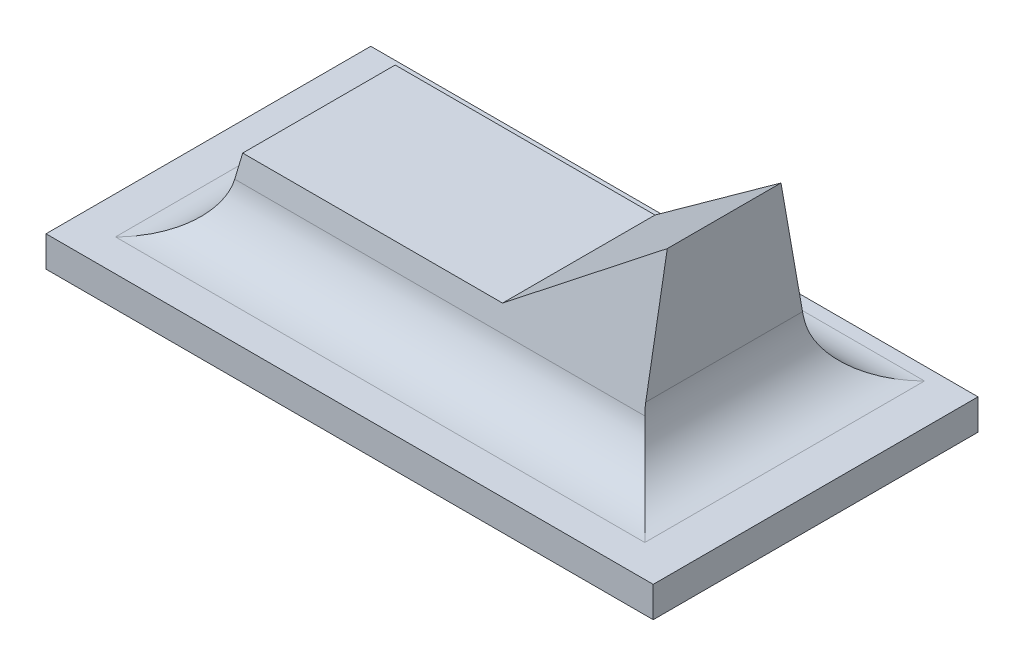
ISO-10303-21;
HEADER;
FILE_DESCRIPTION(('STEP AP214'),'2;1');
FILE_NAME('part.step','',(''),(''),'','','');
FILE_SCHEMA(('AUTOMOTIVE_DESIGN { 1 0 10303 214 1 1 1 1 }'));
ENDSEC;
DATA;
#1=APPLICATION_CONTEXT('core data for automotive mechanical design processes');
#2=APPLICATION_PROTOCOL_DEFINITION('international standard','automotive_design',2000,#1);
#3=PRODUCT_CONTEXT('',#1,'mechanical');
#4=PRODUCT('Part','Part','',(#3));
#5=PRODUCT_RELATED_PRODUCT_CATEGORY('part','',(#4));
#6=PRODUCT_DEFINITION_FORMATION('','',#4);
#7=PRODUCT_DEFINITION_CONTEXT('part definition',#1,'design');
#8=PRODUCT_DEFINITION('design','',#6,#7);
#9=PRODUCT_DEFINITION_SHAPE('','',#8);
#10=(LENGTH_UNIT() NAMED_UNIT(*) SI_UNIT(.MILLI.,.METRE.));
#11=(NAMED_UNIT(*) PLANE_ANGLE_UNIT() SI_UNIT($,.RADIAN.));
#12=(NAMED_UNIT(*) SI_UNIT($,.STERADIAN.) SOLID_ANGLE_UNIT());
#13=UNCERTAINTY_MEASURE_WITH_UNIT(LENGTH_MEASURE(1.E-05),#10,'distance_accuracy_value','');
#14=(GEOMETRIC_REPRESENTATION_CONTEXT(3) GLOBAL_UNCERTAINTY_ASSIGNED_CONTEXT((#13)) GLOBAL_UNIT_ASSIGNED_CONTEXT((#10,
#11,#12)) REPRESENTATION_CONTEXT('',''));
#15=CARTESIAN_POINT('',(0.,0.,0.));
#16=DIRECTION('',(0.,0.,1.));
#17=DIRECTION('',(1.,0.,0.));
#18=AXIS2_PLACEMENT_3D('',#15,#16,#17);
#19=CARTESIAN_POINT('',(0.,0.,-16.1));
#20=DIRECTION('',(-1.,0.,0.));
#21=DIRECTION('',(0.,0.,1.));
#22=AXIS2_PLACEMENT_3D('',#19,#20,#21);
#23=PLANE('',#22);
#24=DIRECTION('',(0.,-1.,0.));
#25=VECTOR('',#24,1.);
#26=CARTESIAN_POINT('',(0.,0.,0.));
#27=LINE('',#26,#25);
#28=CARTESIAN_POINT('',(0.,1.52,0.));
#29=VERTEX_POINT('',#28);
#30=CARTESIAN_POINT('',(0.,0.,0.));
#31=VERTEX_POINT('',#30);
#32=EDGE_CURVE('E181',#29,#31,#27,.T.);
#33=ORIENTED_EDGE('',*,*,#32,.F.);
#34=DIRECTION('',(0.,0.,1.));
#35=VECTOR('',#34,1.);
#36=CARTESIAN_POINT('',(0.,1.52,-16.1));
#37=LINE('',#36,#35);
#38=CARTESIAN_POINT('',(0.,1.52,-16.1));
#39=VERTEX_POINT('',#38);
#40=EDGE_CURVE('E216',#39,#29,#37,.T.);
#41=ORIENTED_EDGE('',*,*,#40,.F.);
#42=DIRECTION('',(0.,-1.,0.));
#43=VECTOR('',#42,1.);
#44=CARTESIAN_POINT('',(0.,0.,-16.1));
#45=LINE('',#44,#43);
#46=CARTESIAN_POINT('',(0.,0.,-16.1));
#47=VERTEX_POINT('',#46);
#48=EDGE_CURVE('E184',#39,#47,#45,.T.);
#49=ORIENTED_EDGE('',*,*,#48,.T.);
#50=DIRECTION('',(0.,0.,1.));
#51=VECTOR('',#50,1.);
#52=CARTESIAN_POINT('',(0.,0.,-16.1));
#53=LINE('',#52,#51);
#54=EDGE_CURVE('E201',#47,#31,#53,.T.);
#55=ORIENTED_EDGE('',*,*,#54,.T.);
#56=EDGE_LOOP('',(#33,#41,#49,#55));
#57=FACE_BOUND('',#56,.T.);
#58=ADVANCED_FACE('F43',(#57),#23,.T.);
#59=CARTESIAN_POINT('',(0.,1.52,-16.1));
#60=DIRECTION('',(0.,1.,0.));
#61=DIRECTION('',(0.,0.,1.));
#62=AXIS2_PLACEMENT_3D('',#59,#60,#61);
#63=PLANE('',#62);
#64=DIRECTION('',(0.,0.,1.));
#65=VECTOR('',#64,1.);
#66=CARTESIAN_POINT('',(1.85792397591769,1.52,-12.9347771305505));
#67=LINE('',#66,#65);
#68=CARTESIAN_POINT('',(1.85792397591769,1.52,-1.58792397591769));
#69=VERTEX_POINT('',#68);
#70=CARTESIAN_POINT('',(1.85792397591769,1.52,-15.4520760240823));
#71=VERTEX_POINT('',#70);
#72=EDGE_CURVE('E235',#69,#71,#67,.F.);
#73=ORIENTED_EDGE('',*,*,#72,.T.);
#74=DIRECTION('',(-1.,0.,0.));
#75=VECTOR('',#74,1.);
#76=CARTESIAN_POINT('',(25.094859471218,1.52,-15.4520760240823));
#77=LINE('',#76,#75);
#78=CARTESIAN_POINT('',(28.094859471218,1.52,-15.4520760240823));
#79=VERTEX_POINT('',#78);
#80=EDGE_CURVE('E238',#71,#79,#77,.F.);
#81=ORIENTED_EDGE('',*,*,#80,.T.);
#82=DIRECTION('',(0.,0.,1.));
#83=VECTOR('',#82,1.);
#84=CARTESIAN_POINT('',(28.094859471218,1.52,-4.10522286944953));
#85=LINE('',#84,#83);
#86=CARTESIAN_POINT('',(28.094859471218,1.52,-1.58792397591769));
#87=VERTEX_POINT('',#86);
#88=EDGE_CURVE('E229',#79,#87,#85,.T.);
#89=ORIENTED_EDGE('',*,*,#88,.T.);
#90=DIRECTION('',(1.,0.,0.));
#91=VECTOR('',#90,1.);
#92=CARTESIAN_POINT('',(4.37522286944952,1.52,-1.58792397591769));
#93=LINE('',#92,#91);
#94=EDGE_CURVE('E232',#87,#69,#93,.F.);
#95=ORIENTED_EDGE('',*,*,#94,.T.);
#96=EDGE_LOOP('',(#73,#81,#89,#95));
#97=FACE_BOUND('',#96,.T.);
#98=DIRECTION('',(-1.,0.,0.));
#99=VECTOR('',#98,1.);
#100=CARTESIAN_POINT('',(0.,1.52,0.));
#101=LINE('',#100,#99);
#102=CARTESIAN_POINT('',(30.1,1.52,0.));
#103=VERTEX_POINT('',#102);
#104=EDGE_CURVE('E189',#103,#29,#101,.T.);
#105=ORIENTED_EDGE('',*,*,#104,.F.);
#106=DIRECTION('',(0.,0.,1.));
#107=VECTOR('',#106,1.);
#108=CARTESIAN_POINT('',(30.1,1.52,-16.1));
#109=LINE('',#108,#107);
#110=CARTESIAN_POINT('',(30.1,1.52,-16.1));
#111=VERTEX_POINT('',#110);
#112=EDGE_CURVE('E219',#111,#103,#109,.T.);
#113=ORIENTED_EDGE('',*,*,#112,.F.);
#114=DIRECTION('',(-1.,0.,0.));
#115=VECTOR('',#114,1.);
#116=CARTESIAN_POINT('',(0.,1.52,-16.1));
#117=LINE('',#116,#115);
#118=EDGE_CURVE('E197',#111,#39,#117,.T.);
#119=ORIENTED_EDGE('',*,*,#118,.T.);
#120=ORIENTED_EDGE('',*,*,#40,.T.);
#121=EDGE_LOOP('',(#105,#113,#119,#120));
#122=FACE_BOUND('',#121,.T.);
#123=ADVANCED_FACE('F294',(#97,#122),#63,.T.);
#124=CARTESIAN_POINT('',(30.1,0.,-16.1));
#125=DIRECTION('',(1.,0.,0.));
#126=DIRECTION('',(0.,0.,-1.));
#127=AXIS2_PLACEMENT_3D('',#124,#125,#126);
#128=PLANE('',#127);
#129=DIRECTION('',(0.,1.,0.));
#130=VECTOR('',#129,1.);
#131=CARTESIAN_POINT('',(30.1,0.,0.));
#132=LINE('',#131,#130);
#133=CARTESIAN_POINT('',(30.1,0.,0.));
#134=VERTEX_POINT('',#133);
#135=EDGE_CURVE('E209',#134,#103,#132,.T.);
#136=ORIENTED_EDGE('',*,*,#135,.F.);
#137=DIRECTION('',(0.,0.,1.));
#138=VECTOR('',#137,1.);
#139=CARTESIAN_POINT('',(30.1,0.,-16.1));
#140=LINE('',#139,#138);
#141=CARTESIAN_POINT('',(30.1,0.,-16.1));
#142=VERTEX_POINT('',#141);
#143=EDGE_CURVE('E222',#142,#134,#140,.T.);
#144=ORIENTED_EDGE('',*,*,#143,.F.);
#145=DIRECTION('',(0.,1.,0.));
#146=VECTOR('',#145,1.);
#147=CARTESIAN_POINT('',(30.1,0.,-16.1));
#148=LINE('',#147,#146);
#149=EDGE_CURVE('E193',#142,#111,#148,.T.);
#150=ORIENTED_EDGE('',*,*,#149,.T.);
#151=ORIENTED_EDGE('',*,*,#112,.T.);
#152=EDGE_LOOP('',(#136,#144,#150,#151));
#153=FACE_BOUND('',#152,.T.);
#154=ADVANCED_FACE('F297',(#153),#128,.T.);
#155=CARTESIAN_POINT('',(0.,0.,-16.1));
#156=DIRECTION('',(0.,-1.,0.));
#157=DIRECTION('',(0.,0.,-1.));
#158=AXIS2_PLACEMENT_3D('',#155,#156,#157);
#159=PLANE('',#158);
#160=DIRECTION('',(1.,0.,0.));
#161=VECTOR('',#160,1.);
#162=CARTESIAN_POINT('',(0.,0.,0.));
#163=LINE('',#162,#161);
#164=EDGE_CURVE('E205',#31,#134,#163,.T.);
#165=ORIENTED_EDGE('',*,*,#164,.F.);
#166=ORIENTED_EDGE('',*,*,#54,.F.);
#167=DIRECTION('',(1.,0.,0.));
#168=VECTOR('',#167,1.);
#169=CARTESIAN_POINT('',(0.,0.,-16.1));
#170=LINE('',#169,#168);
#171=EDGE_CURVE('E188',#47,#142,#170,.T.);
#172=ORIENTED_EDGE('',*,*,#171,.T.);
#173=ORIENTED_EDGE('',*,*,#143,.T.);
#174=EDGE_LOOP('',(#165,#166,#172,#173));
#175=FACE_BOUND('',#174,.T.);
#176=ADVANCED_FACE('F314',(#175),#159,.T.);
#177=CARTESIAN_POINT('',(0.,0.,-16.1));
#178=DIRECTION('',(0.,0.,-1.));
#179=DIRECTION('',(-1.,0.,0.));
#180=AXIS2_PLACEMENT_3D('',#177,#178,#179);
#181=PLANE('',#180);
#182=ORIENTED_EDGE('',*,*,#48,.F.);
#183=ORIENTED_EDGE('',*,*,#118,.F.);
#184=ORIENTED_EDGE('',*,*,#149,.F.);
#185=ORIENTED_EDGE('',*,*,#171,.F.);
#186=EDGE_LOOP('',(#182,#183,#184,#185));
#187=FACE_BOUND('',#186,.T.);
#188=ADVANCED_FACE('F311',(#187),#181,.T.);
#189=CARTESIAN_POINT('',(0.,0.,0.));
#190=DIRECTION('',(0.,0.,-1.));
#191=DIRECTION('',(-1.,0.,0.));
#192=AXIS2_PLACEMENT_3D('',#189,#190,#191);
#193=PLANE('',#192);
#194=ORIENTED_EDGE('',*,*,#32,.T.);
#195=ORIENTED_EDGE('',*,*,#164,.T.);
#196=ORIENTED_EDGE('',*,*,#135,.T.);
#197=ORIENTED_EDGE('',*,*,#104,.T.);
#198=EDGE_LOOP('',(#194,#195,#196,#197));
#199=FACE_BOUND('',#198,.T.);
#200=ADVANCED_FACE('F302',(#199),#193,.F.);
#201=CARTESIAN_POINT('',(5.01,5.12,-12.3));
#202=DIRECTION('',(-0.984807753012208,0.173648177666931,0.));
#203=DIRECTION('',(-0.173648177666931,-0.984807753012208,0.));
#204=AXIS2_PLACEMENT_3D('',#201,#202,#203);
#205=PLANE('',#204);
#206=DIRECTION('',(0.171087869746036,0.970287525247814,0.171087869746036));
#207=VECTOR('',#206,1.);
#208=CARTESIAN_POINT('',(5.01,5.12,-12.3));
#209=LINE('',#208,#207);
#210=CARTESIAN_POINT('',(4.81234723495431,3.99905546699921,-12.4976527650457));
#211=VERTEX_POINT('',#210);
#212=CARTESIAN_POINT('',(5.01,5.12,-12.3));
#213=VERTEX_POINT('',#212);
#214=EDGE_CURVE('E178',#211,#213,#209,.T.);
#215=ORIENTED_EDGE('',*,*,#214,.F.);
#216=DIRECTION('',(0.,0.,1.));
#217=VECTOR('',#216,1.);
#218=CARTESIAN_POINT('',(4.81234723495431,3.99905546699921,-4.10522286944953));
#219=LINE('',#218,#217);
#220=CARTESIAN_POINT('',(4.81234723495431,3.99905546699921,-4.54234723495431));
#221=VERTEX_POINT('',#220);
#222=EDGE_CURVE('E242',#211,#221,#219,.T.);
#223=ORIENTED_EDGE('',*,*,#222,.T.);
#224=DIRECTION('',(0.171087869746036,0.970287525247814,-0.171087869746036));
#225=VECTOR('',#224,1.);
#226=CARTESIAN_POINT('',(5.23128920735723,6.37499345856266,-4.96128920735723));
#227=LINE('',#226,#225);
#228=CARTESIAN_POINT('',(5.01,5.12,-4.74));
#229=VERTEX_POINT('',#228);
#230=EDGE_CURVE('E177',#221,#229,#227,.T.);
#231=ORIENTED_EDGE('',*,*,#230,.T.);
#232=DIRECTION('',(0.,0.,1.));
#233=VECTOR('',#232,1.);
#234=CARTESIAN_POINT('',(5.01,5.12,-12.3));
#235=LINE('',#234,#233);
#236=EDGE_CURVE('E157',#213,#229,#235,.T.);
#237=ORIENTED_EDGE('',*,*,#236,.F.);
#238=EDGE_LOOP('',(#215,#223,#231,#237));
#239=FACE_BOUND('',#238,.T.);
#240=ADVANCED_FACE('F284',(#239),#205,.T.);
#241=CARTESIAN_POINT('',(5.01,5.12,-12.3));
#242=DIRECTION('',(0.,0.173648177666931,-0.984807753012208));
#243=DIRECTION('',(0.,0.984807753012208,0.173648177666931));
#244=AXIS2_PLACEMENT_3D('',#241,#242,#243);
#245=PLANE('',#244);
#246=DIRECTION('',(0.,0.984807753012208,0.173648177666931));
#247=VECTOR('',#246,1.);
#248=CARTESIAN_POINT('',(25.094859471218,3.16237245771921,-12.6451825538821));
#249=LINE('',#248,#247);
#250=CARTESIAN_POINT('',(25.094859471218,4.52,-12.4057961884251));
#251=VERTEX_POINT('',#250);
#252=CARTESIAN_POINT('',(25.0948594712191,10.5800000000016,-11.3372546853315));
#253=VERTEX_POINT('',#252);
#254=EDGE_CURVE('E135',#251,#253,#249,.T.);
#255=ORIENTED_EDGE('',*,*,#254,.F.);
#256=CARTESIAN_POINT('',(28.094859471218,4.52,-12.4057961884251));
#257=DIRECTION('',(0.,0.173648177666931,-0.984807753012208));
#258=DIRECTION('',(0.,-0.984807753012208,-0.173648177666931));
#259=AXIS2_PLACEMENT_3D('',#256,#257,#258);
#260=ELLIPSE('',#259,3.04627983565724,3.);
#261=CARTESIAN_POINT('',(25.1404362121814,3.99905546699921,-12.4976527650457));
#262=VERTEX_POINT('',#261);
#263=EDGE_CURVE('E11',#251,#262,#260,.F.);
#264=ORIENTED_EDGE('',*,*,#263,.T.);
#265=DIRECTION('',(-1.,0.,0.));
#266=VECTOR('',#265,1.);
#267=CARTESIAN_POINT('',(4.37522286944952,3.99905546699921,-12.4976527650457));
#268=LINE('',#267,#266);
#269=EDGE_CURVE('E69',#262,#211,#268,.T.);
#270=ORIENTED_EDGE('',*,*,#269,.T.);
#271=ORIENTED_EDGE('',*,*,#214,.T.);
#272=DIRECTION('',(-1.,0.,0.));
#273=VECTOR('',#272,1.);
#274=CARTESIAN_POINT('',(5.01,5.12,-12.3));
#275=LINE('',#274,#273);
#276=CARTESIAN_POINT('',(17.89,5.12,-12.3));
#277=VERTEX_POINT('',#276);
#278=EDGE_CURVE('E153',#277,#213,#275,.T.);
#279=ORIENTED_EDGE('',*,*,#278,.F.);
#280=DIRECTION('',(-0.792516080250183,-0.600586009408241,-0.105899517694701));
#281=VECTOR('',#280,1.);
#282=CARTESIAN_POINT('',(9.02100419426536,-1.60111889104268,-13.4851146010402));
#283=LINE('',#282,#281);
#284=EDGE_CURVE('E150',#253,#277,#283,.T.);
#285=ORIENTED_EDGE('',*,*,#284,.F.);
#286=EDGE_LOOP('',(#255,#264,#270,#271,#279,#285));
#287=FACE_BOUND('',#286,.T.);
#288=ADVANCED_FACE('F151',(#287),#245,.T.);
#289=CARTESIAN_POINT('',(5.01,5.12,-4.74));
#290=DIRECTION('',(0.,0.173648177666931,0.984807753012208));
#291=DIRECTION('',(0.,-0.984807753012208,0.173648177666931));
#292=AXIS2_PLACEMENT_3D('',#289,#290,#291);
#293=PLANE('',#292);
#294=ORIENTED_EDGE('',*,*,#230,.F.);
#295=DIRECTION('',(1.,0.,0.));
#296=VECTOR('',#295,1.);
#297=CARTESIAN_POINT('',(25.094859471218,3.99905546699921,-4.54234723495431));
#298=LINE('',#297,#296);
#299=CARTESIAN_POINT('',(25.1404362121814,3.99905546699921,-4.54234723495431));
#300=VERTEX_POINT('',#299);
#301=EDGE_CURVE('E61',#221,#300,#298,.T.);
#302=ORIENTED_EDGE('',*,*,#301,.T.);
#303=CARTESIAN_POINT('',(28.094859471218,4.52,-4.63420381157492));
#304=DIRECTION('',(0.,0.173648177666931,0.984807753012208));
#305=DIRECTION('',(0.,0.984807753012208,-0.173648177666931));
#306=AXIS2_PLACEMENT_3D('',#303,#304,#305);
#307=ELLIPSE('',#306,3.04627983565724,3.);
#308=CARTESIAN_POINT('',(25.094859471218,4.52,-4.63420381157492));
#309=VERTEX_POINT('',#308);
#310=EDGE_CURVE('E53',#300,#309,#307,.F.);
#311=ORIENTED_EDGE('',*,*,#310,.T.);
#312=DIRECTION('',(0.,0.984807753012208,-0.173648177666931));
#313=VECTOR('',#312,1.);
#314=CARTESIAN_POINT('',(25.094859471218,5.12,-4.74));
#315=LINE('',#314,#313);
#316=CARTESIAN_POINT('',(25.0948594712201,10.5800000000016,-5.7027453146685));
#317=VERTEX_POINT('',#316);
#318=EDGE_CURVE('E266',#309,#317,#315,.T.);
#319=ORIENTED_EDGE('',*,*,#318,.T.);
#320=DIRECTION('',(-0.792516080250183,-0.600586009408241,0.105899517694701));
#321=VECTOR('',#320,1.);
#322=CARTESIAN_POINT('',(9.80030722157813,-1.01054602197762,-3.65901932985039));
#323=LINE('',#322,#321);
#324=CARTESIAN_POINT('',(17.8899999999983,5.12000000000943,-4.74000000000166));
#325=VERTEX_POINT('',#324);
#326=EDGE_CURVE('E147',#317,#325,#323,.T.);
#327=ORIENTED_EDGE('',*,*,#326,.T.);
#328=DIRECTION('',(1.,0.,0.));
#329=VECTOR('',#328,1.);
#330=CARTESIAN_POINT('',(5.01,5.12,-4.74));
#331=LINE('',#330,#329);
#332=EDGE_CURVE('E168',#229,#325,#331,.T.);
#333=ORIENTED_EDGE('',*,*,#332,.F.);
#334=EDGE_LOOP('',(#294,#302,#311,#319,#327,#333));
#335=FACE_BOUND('',#334,.T.);
#336=ADVANCED_FACE('F278',(#335),#293,.T.);
#337=CARTESIAN_POINT('',(0.,5.12,0.));
#338=DIRECTION('',(0.,1.,0.));
#339=DIRECTION('',(0.,0.,1.));
#340=AXIS2_PLACEMENT_3D('',#337,#338,#339);
#341=PLANE('',#340);
#342=ORIENTED_EDGE('',*,*,#236,.T.);
#343=ORIENTED_EDGE('',*,*,#332,.T.);
#344=DIRECTION('',(0.,0.,-1.));
#345=VECTOR('',#344,1.);
#346=CARTESIAN_POINT('',(17.89,5.12,-12.3));
#347=LINE('',#346,#345);
#348=EDGE_CURVE('E172',#325,#277,#347,.T.);
#349=ORIENTED_EDGE('',*,*,#348,.T.);
#350=ORIENTED_EDGE('',*,*,#278,.T.);
#351=EDGE_LOOP('',(#342,#343,#349,#350));
#352=FACE_BOUND('',#351,.T.);
#353=ADVANCED_FACE('F280',(#352),#341,.T.);
#354=CARTESIAN_POINT('',(25.094859471218,5.12,-23.747440044002));
#355=DIRECTION('',(1.,0.,0.));
#356=DIRECTION('',(0.,0.,-1.));
#357=AXIS2_PLACEMENT_3D('',#354,#355,#356);
#358=PLANE('',#357);
#359=ORIENTED_EDGE('',*,*,#318,.F.);
#360=DIRECTION('',(0.,0.,1.));
#361=VECTOR('',#360,1.);
#362=CARTESIAN_POINT('',(25.094859471218,4.52,-12.9347771305505));
#363=LINE('',#362,#361);
#364=EDGE_CURVE('E143',#309,#251,#363,.F.);
#365=ORIENTED_EDGE('',*,*,#364,.T.);
#366=ORIENTED_EDGE('',*,*,#254,.T.);
#367=DIRECTION('',(0.,0.,1.));
#368=VECTOR('',#367,1.);
#369=CARTESIAN_POINT('',(25.0948594712201,10.5800000000016,-24.7101853586705));
#370=LINE('',#369,#368);
#371=EDGE_CURVE('E140',#253,#317,#370,.T.);
#372=ORIENTED_EDGE('',*,*,#371,.T.);
#373=EDGE_LOOP('',(#359,#365,#366,#372));
#374=FACE_BOUND('',#373,.T.);
#375=ADVANCED_FACE('F138',(#374),#358,.T.);
#376=CARTESIAN_POINT('',(9.80030722157813,-1.01054602197762,-22.6664593738524));
#377=DIRECTION('',(-0.603982300884956,0.796997729117037,0.));
#378=DIRECTION('',(-0.796997729117037,-0.603982300884956,0.));
#379=AXIS2_PLACEMENT_3D('',#376,#377,#378);
#380=PLANE('',#379);
#381=ORIENTED_EDGE('',*,*,#371,.F.);
#382=ORIENTED_EDGE('',*,*,#284,.T.);
#383=ORIENTED_EDGE('',*,*,#348,.F.);
#384=ORIENTED_EDGE('',*,*,#326,.F.);
#385=EDGE_LOOP('',(#381,#382,#383,#384));
#386=FACE_BOUND('',#385,.T.);
#387=ADVANCED_FACE('F159',(#386),#380,.T.);
#388=CARTESIAN_POINT('',(5.01,4.52,-1.58792397591769));
#389=DIRECTION('',(-1.,0.,0.));
#390=DIRECTION('',(0.,0.,1.));
#391=AXIS2_PLACEMENT_3D('',#388,#389,#390);
#392=CYLINDRICAL_SURFACE('',#391,3.);
#393=CARTESIAN_POINT('',(1.85792397591769,4.52,-1.58792397591769));
#394=DIRECTION('',(-0.707106781186548,0.,-0.707106781186547));
#395=DIRECTION('',(-0.707106781186547,0.,0.707106781186548));
#396=AXIS2_PLACEMENT_3D('',#393,#394,#395);
#397=ELLIPSE('',#396,4.24264068711928,3.);
#398=EDGE_CURVE('E256',#69,#221,#397,.F.);
#399=ORIENTED_EDGE('',*,*,#398,.F.);
#400=ORIENTED_EDGE('',*,*,#94,.F.);
#401=CARTESIAN_POINT('',(28.094859471218,4.52,-1.58792397591769));
#402=DIRECTION('',(0.707106781186547,0.,-0.707106781186547));
#403=DIRECTION('',(-0.707106781186547,0.,-0.707106781186547));
#404=AXIS2_PLACEMENT_3D('',#401,#402,#403);
#405=ELLIPSE('',#404,4.24264068711928,3.);
#406=EDGE_CURVE('E47',#300,#87,#405,.F.);
#407=ORIENTED_EDGE('',*,*,#406,.F.);
#408=ORIENTED_EDGE('',*,*,#301,.F.);
#409=EDGE_LOOP('',(#399,#400,#407,#408));
#410=FACE_BOUND('',#409,.T.);
#411=ADVANCED_FACE('F45',(#410),#392,.F.);
#412=CARTESIAN_POINT('',(28.094859471218,4.52,-16.1));
#413=DIRECTION('',(0.,0.,-1.));
#414=DIRECTION('',(-1.,0.,0.));
#415=AXIS2_PLACEMENT_3D('',#412,#413,#414);
#416=CYLINDRICAL_SURFACE('',#415,3.);
#417=ORIENTED_EDGE('',*,*,#406,.T.);
#418=ORIENTED_EDGE('',*,*,#88,.F.);
#419=CARTESIAN_POINT('',(28.094859471218,4.52,-15.4520760240823));
#420=DIRECTION('',(-0.707106781186547,0.,-0.707106781186547));
#421=DIRECTION('',(0.707106781186547,0.,-0.707106781186547));
#422=AXIS2_PLACEMENT_3D('',#419,#420,#421);
#423=ELLIPSE('',#422,4.24264068711928,3.);
#424=EDGE_CURVE('E254',#262,#79,#423,.F.);
#425=ORIENTED_EDGE('',*,*,#424,.F.);
#426=ORIENTED_EDGE('',*,*,#263,.F.);
#427=ORIENTED_EDGE('',*,*,#364,.F.);
#428=ORIENTED_EDGE('',*,*,#310,.F.);
#429=EDGE_LOOP('',(#417,#418,#425,#426,#427,#428));
#430=FACE_BOUND('',#429,.T.);
#431=ADVANCED_FACE('F287',(#430),#416,.F.);
#432=CARTESIAN_POINT('',(1.85792397591769,4.52,-12.3));
#433=DIRECTION('',(0.,0.,-1.));
#434=DIRECTION('',(-1.,0.,0.));
#435=AXIS2_PLACEMENT_3D('',#432,#433,#434);
#436=CYLINDRICAL_SURFACE('',#435,3.);
#437=ORIENTED_EDGE('',*,*,#398,.T.);
#438=ORIENTED_EDGE('',*,*,#222,.F.);
#439=CARTESIAN_POINT('',(1.85792397591769,4.52,-15.4520760240823));
#440=DIRECTION('',(0.707106781186547,0.,-0.707106781186548));
#441=DIRECTION('',(-0.707106781186548,0.,-0.707106781186547));
#442=AXIS2_PLACEMENT_3D('',#439,#440,#441);
#443=ELLIPSE('',#442,4.24264068711929,3.);
#444=EDGE_CURVE('E251',#71,#211,#443,.F.);
#445=ORIENTED_EDGE('',*,*,#444,.F.);
#446=ORIENTED_EDGE('',*,*,#72,.F.);
#447=EDGE_LOOP('',(#437,#438,#445,#446));
#448=FACE_BOUND('',#447,.T.);
#449=ADVANCED_FACE('F293',(#448),#436,.F.);
#450=CARTESIAN_POINT('',(5.01,4.52,-15.4520760240823));
#451=DIRECTION('',(1.,0.,0.));
#452=DIRECTION('',(0.,0.,-1.));
#453=AXIS2_PLACEMENT_3D('',#450,#451,#452);
#454=CYLINDRICAL_SURFACE('',#453,3.);
#455=ORIENTED_EDGE('',*,*,#424,.T.);
#456=ORIENTED_EDGE('',*,*,#80,.F.);
#457=ORIENTED_EDGE('',*,*,#444,.T.);
#458=ORIENTED_EDGE('',*,*,#269,.F.);
#459=EDGE_LOOP('',(#455,#456,#457,#458));
#460=FACE_BOUND('',#459,.T.);
#461=ADVANCED_FACE('F290',(#460),#454,.F.);
#462=CLOSED_SHELL('',(#58,#123,#154,#176,#188,#200,#240,#288,#336,#353,#375,#387,#411,#431,#449,#461));
#463=MANIFOLD_SOLID_BREP('B2',#462);
#464=ADVANCED_BREP_SHAPE_REPRESENTATION('',(#18,#463),#14);
#465=SHAPE_DEFINITION_REPRESENTATION(#9,#464);
ENDSEC;
END-ISO-10303-21;
